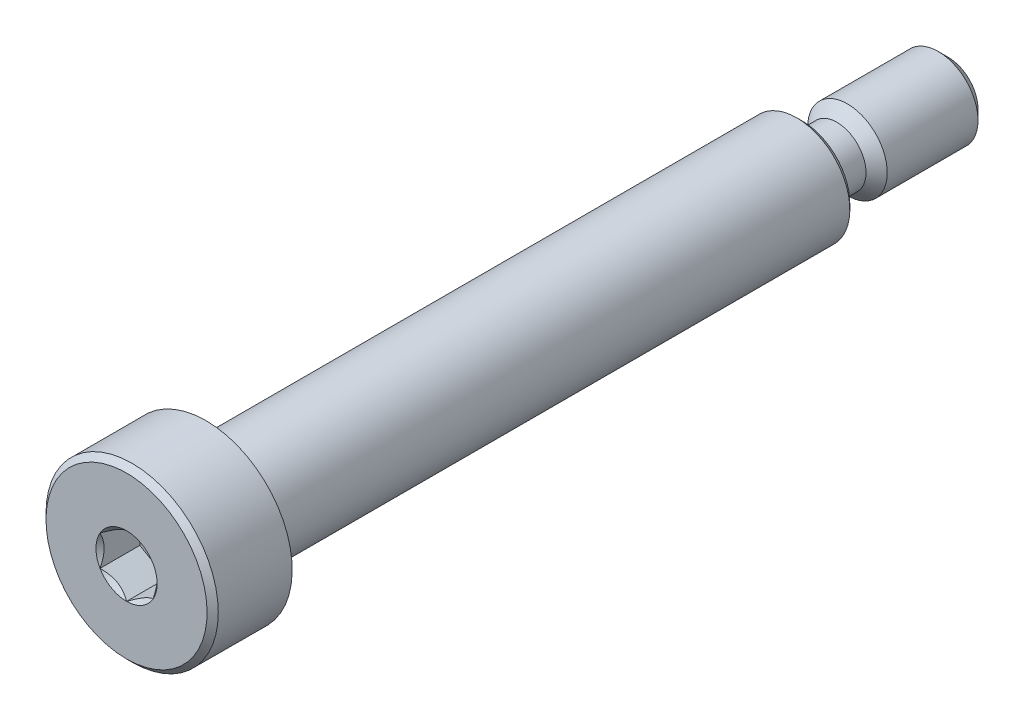
ISO-10303-21;
HEADER;
FILE_DESCRIPTION(('STEP AP214'),'2;1');
FILE_NAME('part.step','',(''),(''),'','','');
FILE_SCHEMA(('AUTOMOTIVE_DESIGN { 1 0 10303 214 1 1 1 1 }'));
ENDSEC;
DATA;
#1=APPLICATION_CONTEXT('core data for automotive mechanical design processes');
#2=APPLICATION_PROTOCOL_DEFINITION('international standard','automotive_design',2000,#1);
#3=PRODUCT_CONTEXT('',#1,'mechanical');
#4=PRODUCT('Part','Part','',(#3));
#5=PRODUCT_RELATED_PRODUCT_CATEGORY('part','',(#4));
#6=PRODUCT_DEFINITION_FORMATION('','',#4);
#7=PRODUCT_DEFINITION_CONTEXT('part definition',#1,'design');
#8=PRODUCT_DEFINITION('design','',#6,#7);
#9=PRODUCT_DEFINITION_SHAPE('','',#8);
#10=(LENGTH_UNIT() NAMED_UNIT(*) SI_UNIT(.MILLI.,.METRE.));
#11=(NAMED_UNIT(*) PLANE_ANGLE_UNIT() SI_UNIT($,.RADIAN.));
#12=(NAMED_UNIT(*) SI_UNIT($,.STERADIAN.) SOLID_ANGLE_UNIT());
#13=UNCERTAINTY_MEASURE_WITH_UNIT(LENGTH_MEASURE(1.E-05),#10,'distance_accuracy_value','');
#14=(GEOMETRIC_REPRESENTATION_CONTEXT(3) GLOBAL_UNCERTAINTY_ASSIGNED_CONTEXT((#13)) GLOBAL_UNIT_ASSIGNED_CONTEXT((#10,
#11,#12)) REPRESENTATION_CONTEXT('',''));
#15=CARTESIAN_POINT('',(0.,0.,0.));
#16=DIRECTION('',(0.,0.,1.));
#17=DIRECTION('',(1.,0.,0.));
#18=AXIS2_PLACEMENT_3D('',#15,#16,#17);
#19=CARTESIAN_POINT('',(0.,0.,-62.));
#20=DIRECTION('',(0.,0.,-1.));
#21=DIRECTION('',(0.,1.,0.));
#22=AXIS2_PLACEMENT_3D('',#19,#20,#21);
#23=CYLINDRICAL_SURFACE('',#22,4.);
#24=CARTESIAN_POINT('',(0.,0.,-50.5775));
#25=DIRECTION('',(0.,0.,-1.));
#26=DIRECTION('',(0.,1.,0.));
#27=AXIS2_PLACEMENT_3D('',#24,#25,#26);
#28=CIRCLE('',#27,4.);
#29=CARTESIAN_POINT('',(0.,4.,-50.5775));
#30=VERTEX_POINT('',#29);
#31=EDGE_CURVE('E244',#30,#30,#28,.F.);
#32=ORIENTED_EDGE('',*,*,#31,.T.);
#33=EDGE_LOOP('',(#32));
#34=FACE_BOUND('',#33,.T.);
#35=CARTESIAN_POINT('',(0.,0.,-7.12666666666666));
#36=DIRECTION('',(0.,0.,-1.));
#37=DIRECTION('',(0.,1.,0.));
#38=AXIS2_PLACEMENT_3D('',#35,#36,#37);
#39=CIRCLE('',#38,4.);
#40=CARTESIAN_POINT('',(0.,4.,-7.12666666666666));
#41=VERTEX_POINT('',#40);
#42=EDGE_CURVE('E266',#41,#41,#39,.T.);
#43=ORIENTED_EDGE('',*,*,#42,.T.);
#44=EDGE_LOOP('',(#43));
#45=FACE_BOUND('',#44,.T.);
#46=ADVANCED_FACE('F36',(#34,#45),#23,.T.);
#47=CARTESIAN_POINT('',(0.,-4.,-51.));
#48=DIRECTION('',(0.,0.,-1.));
#49=DIRECTION('',(0.,1.,0.));
#50=AXIS2_PLACEMENT_3D('',#47,#48,#49);
#51=PLANE('',#50);
#52=CARTESIAN_POINT('',(0.,0.,-51.));
#53=DIRECTION('',(0.,0.,-1.));
#54=DIRECTION('',(0.,1.,0.));
#55=AXIS2_PLACEMENT_3D('',#52,#53,#54);
#56=CIRCLE('',#55,3.5775);
#57=CARTESIAN_POINT('',(0.,3.5775,-51.));
#58=VERTEX_POINT('',#57);
#59=EDGE_CURVE('E247',#58,#58,#56,.T.);
#60=ORIENTED_EDGE('',*,*,#59,.T.);
#61=EDGE_LOOP('',(#60));
#62=FACE_BOUND('',#61,.T.);
#63=CARTESIAN_POINT('',(0.,0.,-51.));
#64=DIRECTION('',(0.,0.,-1.));
#65=DIRECTION('',(0.,1.,0.));
#66=AXIS2_PLACEMENT_3D('',#63,#64,#65);
#67=CIRCLE('',#66,3.00000000000001);
#68=CARTESIAN_POINT('',(0.,3.00000000000001,-51.));
#69=VERTEX_POINT('',#68);
#70=EDGE_CURVE('E286',#69,#69,#67,.T.);
#71=ORIENTED_EDGE('',*,*,#70,.F.);
#72=EDGE_LOOP('',(#71));
#73=FACE_BOUND('',#72,.T.);
#74=ADVANCED_FACE('F198',(#62,#73),#51,.T.);
#75=CARTESIAN_POINT('',(0.,0.,-62.));
#76=DIRECTION('',(0.,0.,-1.));
#77=DIRECTION('',(0.,1.,0.));
#78=AXIS2_PLACEMENT_3D('',#75,#76,#77);
#79=CYLINDRICAL_SURFACE('',#78,3.13333333333333);
#80=CARTESIAN_POINT('',(0.,0.,-6.60666666666668));
#81=DIRECTION('',(0.,0.,-1.));
#82=DIRECTION('',(0.,1.,0.));
#83=AXIS2_PLACEMENT_3D('',#80,#81,#82);
#84=CIRCLE('',#83,3.13333333333333);
#85=CARTESIAN_POINT('',(0.,3.13333333333333,-6.60666666666668));
#86=VERTEX_POINT('',#85);
#87=EDGE_CURVE('E282',#86,#86,#84,.F.);
#88=ORIENTED_EDGE('',*,*,#87,.T.);
#89=EDGE_LOOP('',(#88));
#90=FACE_BOUND('',#89,.T.);
#91=CARTESIAN_POINT('',(0.,0.,-6.));
#92=DIRECTION('',(0.,0.,-1.));
#93=DIRECTION('',(0.,1.,0.));
#94=AXIS2_PLACEMENT_3D('',#91,#92,#93);
#95=CIRCLE('',#94,3.13333333333333);
#96=CARTESIAN_POINT('',(0.,3.13333333333333,-6.));
#97=VERTEX_POINT('',#96);
#98=EDGE_CURVE('E267',#97,#97,#95,.T.);
#99=ORIENTED_EDGE('',*,*,#98,.T.);
#100=EDGE_LOOP('',(#99));
#101=FACE_BOUND('',#100,.T.);
#102=ADVANCED_FACE('F204',(#90,#101),#79,.T.);
#103=CARTESIAN_POINT('',(0.,4.,-6.86666666666667));
#104=DIRECTION('',(0.,0.,-1.));
#105=DIRECTION('',(0.,1.,0.));
#106=AXIS2_PLACEMENT_3D('',#103,#104,#105);
#107=PLANE('',#106);
#108=CARTESIAN_POINT('',(0.,0.,-6.86666666666667));
#109=DIRECTION('',(0.,0.,-1.));
#110=DIRECTION('',(0.,1.,0.));
#111=AXIS2_PLACEMENT_3D('',#108,#109,#110);
#112=CIRCLE('',#111,3.74000000000001);
#113=CARTESIAN_POINT('',(0.,3.74000000000001,-6.86666666666667));
#114=VERTEX_POINT('',#113);
#115=EDGE_CURVE('E279',#114,#114,#112,.F.);
#116=ORIENTED_EDGE('',*,*,#115,.T.);
#117=EDGE_LOOP('',(#116));
#118=FACE_BOUND('',#117,.T.);
#119=CARTESIAN_POINT('',(0.,0.,-6.86666666666667));
#120=DIRECTION('',(0.,0.,-1.));
#121=DIRECTION('',(0.,1.,0.));
#122=AXIS2_PLACEMENT_3D('',#119,#120,#121);
#123=CIRCLE('',#122,3.39333333333332);
#124=CARTESIAN_POINT('',(0.,3.39333333333332,-6.86666666666667));
#125=VERTEX_POINT('',#124);
#126=EDGE_CURVE('E270',#125,#125,#123,.T.);
#127=ORIENTED_EDGE('',*,*,#126,.T.);
#128=EDGE_LOOP('',(#127));
#129=FACE_BOUND('',#128,.T.);
#130=ADVANCED_FACE('F222',(#118,#129),#107,.F.);
#131=CARTESIAN_POINT('',(0.,0.,0.));
#132=DIRECTION('',(0.,0.,1.));
#133=DIRECTION('',(0.,-1.,0.));
#134=AXIS2_PLACEMENT_3D('',#131,#132,#133);
#135=PLANE('',#134);
#136=CARTESIAN_POINT('',(0.,0.,0.));
#137=DIRECTION('',(0.,0.,1.));
#138=DIRECTION('',(1.,0.,0.));
#139=AXIS2_PLACEMENT_3D('',#136,#137,#138);
#140=CIRCLE('',#139,2.3094010767585);
#141=CARTESIAN_POINT('',(0.,-2.3094010767585,0.));
#142=VERTEX_POINT('',#141);
#143=CARTESIAN_POINT('',(2.,-1.15470053837925,0.));
#144=VERTEX_POINT('',#143);
#145=EDGE_CURVE('E56',#142,#144,#140,.T.);
#146=ORIENTED_EDGE('',*,*,#145,.F.);
#147=CARTESIAN_POINT('',(-2.,-1.15470053837925,0.));
#148=VERTEX_POINT('',#147);
#149=EDGE_CURVE('E63',#148,#142,#140,.T.);
#150=ORIENTED_EDGE('',*,*,#149,.F.);
#151=CARTESIAN_POINT('',(-2.,1.15470053837925,0.));
#152=VERTEX_POINT('',#151);
#153=EDGE_CURVE('E137',#152,#148,#140,.T.);
#154=ORIENTED_EDGE('',*,*,#153,.F.);
#155=CARTESIAN_POINT('',(0.,2.3094010767585,0.));
#156=VERTEX_POINT('',#155);
#157=EDGE_CURVE('E132',#156,#152,#140,.T.);
#158=ORIENTED_EDGE('',*,*,#157,.F.);
#159=CARTESIAN_POINT('',(2.,1.15470053837925,0.));
#160=VERTEX_POINT('',#159);
#161=EDGE_CURVE('E104',#160,#156,#140,.T.);
#162=ORIENTED_EDGE('',*,*,#161,.F.);
#163=EDGE_CURVE('E95',#144,#160,#140,.T.);
#164=ORIENTED_EDGE('',*,*,#163,.F.);
#165=EDGE_LOOP('',(#146,#150,#154,#158,#162,#164));
#166=FACE_BOUND('',#165,.T.);
#167=CARTESIAN_POINT('',(0.,0.,0.));
#168=DIRECTION('',(0.,0.,1.));
#169=DIRECTION('',(0.,-1.,0.));
#170=AXIS2_PLACEMENT_3D('',#167,#168,#169);
#171=CIRCLE('',#170,6.07749999999999);
#172=CARTESIAN_POINT('',(0.,-6.07749999999999,0.));
#173=VERTEX_POINT('',#172);
#174=EDGE_CURVE('E50',#173,#173,#171,.T.);
#175=ORIENTED_EDGE('',*,*,#174,.T.);
#176=EDGE_LOOP('',(#175));
#177=FACE_BOUND('',#176,.T.);
#178=ADVANCED_FACE('F129',(#166,#177),#135,.T.);
#179=CARTESIAN_POINT('',(0.,0.,-62.));
#180=DIRECTION('',(0.,0.,-1.));
#181=DIRECTION('',(0.,1.,0.));
#182=AXIS2_PLACEMENT_3D('',#179,#180,#181);
#183=CYLINDRICAL_SURFACE('',#182,6.49999999999999);
#184=CARTESIAN_POINT('',(0.,0.,-0.422500000000006));
#185=DIRECTION('',(0.,0.,1.));
#186=DIRECTION('',(0.,-1.,0.));
#187=AXIS2_PLACEMENT_3D('',#184,#185,#186);
#188=CIRCLE('',#187,6.49999999999999);
#189=CARTESIAN_POINT('',(0.,-6.49999999999999,-0.422500000000006));
#190=VERTEX_POINT('',#189);
#191=EDGE_CURVE('E250',#190,#190,#188,.F.);
#192=ORIENTED_EDGE('',*,*,#191,.T.);
#193=EDGE_LOOP('',(#192));
#194=FACE_BOUND('',#193,.T.);
#195=CARTESIAN_POINT('',(0.,0.,-6.));
#196=DIRECTION('',(0.,0.,-1.));
#197=DIRECTION('',(0.,1.,0.));
#198=AXIS2_PLACEMENT_3D('',#195,#196,#197);
#199=CIRCLE('',#198,6.49999999999999);
#200=CARTESIAN_POINT('',(0.,6.49999999999999,-6.));
#201=VERTEX_POINT('',#200);
#202=EDGE_CURVE('E265',#201,#201,#199,.T.);
#203=ORIENTED_EDGE('',*,*,#202,.F.);
#204=EDGE_LOOP('',(#203));
#205=FACE_BOUND('',#204,.T.);
#206=ADVANCED_FACE('F215',(#194,#205),#183,.T.);
#207=CARTESIAN_POINT('',(0.,-6.49999999999999,-6.));
#208=DIRECTION('',(0.,0.,-1.));
#209=DIRECTION('',(0.,1.,0.));
#210=AXIS2_PLACEMENT_3D('',#207,#208,#209);
#211=PLANE('',#210);
#212=ORIENTED_EDGE('',*,*,#202,.T.);
#213=EDGE_LOOP('',(#212));
#214=FACE_BOUND('',#213,.T.);
#215=ORIENTED_EDGE('',*,*,#98,.F.);
#216=EDGE_LOOP('',(#215));
#217=FACE_BOUND('',#216,.T.);
#218=ADVANCED_FACE('F211',(#214,#217),#211,.T.);
#219=CARTESIAN_POINT('',(0.,0.,-7.12666666666666));
#220=DIRECTION('',(0.,0.,-1.));
#221=DIRECTION('',(0.,1.,0.));
#222=AXIS2_PLACEMENT_3D('',#219,#220,#221);
#223=CONICAL_SURFACE('',#222,4.,0.785398163397452);
#224=ORIENTED_EDGE('',*,*,#115,.F.);
#225=EDGE_LOOP('',(#224));
#226=FACE_BOUND('',#225,.T.);
#227=ORIENTED_EDGE('',*,*,#42,.F.);
#228=EDGE_LOOP('',(#227));
#229=FACE_BOUND('',#228,.T.);
#230=ADVANCED_FACE('F214',(#226,#229),#223,.T.);
#231=CARTESIAN_POINT('',(0.,0.,-6.86666666666667));
#232=DIRECTION('',(0.,0.,-1.));
#233=DIRECTION('',(0.,1.,0.));
#234=AXIS2_PLACEMENT_3D('',#231,#232,#233);
#235=CONICAL_SURFACE('',#234,3.39333333333332,0.785398163397454);
#236=ORIENTED_EDGE('',*,*,#87,.F.);
#237=EDGE_LOOP('',(#236));
#238=FACE_BOUND('',#237,.T.);
#239=ORIENTED_EDGE('',*,*,#126,.F.);
#240=EDGE_LOOP('',(#239));
#241=FACE_BOUND('',#240,.T.);
#242=ADVANCED_FACE('F225',(#238,#241),#235,.T.);
#243=CARTESIAN_POINT('',(0.,0.,-51.8));
#244=DIRECTION('',(0.,0.,-1.));
#245=DIRECTION('',(0.,1.,0.));
#246=AXIS2_PLACEMENT_3D('',#243,#244,#245);
#247=TOROIDAL_SURFACE('',#246,3.00000000000001,0.800000000000014);
#248=CARTESIAN_POINT('',(0.,0.,-51.8));
#249=DIRECTION('',(0.,0.,-1.));
#250=DIRECTION('',(0.,1.,0.));
#251=AXIS2_PLACEMENT_3D('',#248,#249,#250);
#252=CIRCLE('',#251,2.2);
#253=CARTESIAN_POINT('',(0.,2.2,-51.8));
#254=VERTEX_POINT('',#253);
#255=EDGE_CURVE('E351',#254,#254,#252,.T.);
#256=ORIENTED_EDGE('',*,*,#255,.F.);
#257=EDGE_LOOP('',(#256));
#258=FACE_BOUND('',#257,.T.);
#259=ORIENTED_EDGE('',*,*,#70,.T.);
#260=EDGE_LOOP('',(#259));
#261=FACE_BOUND('',#260,.T.);
#262=ADVANCED_FACE('F229',(#258,#261),#247,.F.);
#263=CARTESIAN_POINT('',(0.,0.,-62.));
#264=DIRECTION('',(0.,0.,-1.));
#265=DIRECTION('',(0.,1.,0.));
#266=AXIS2_PLACEMENT_3D('',#263,#264,#265);
#267=CYLINDRICAL_SURFACE('',#266,2.2);
#268=CARTESIAN_POINT('',(0.,0.,-53.6));
#269=DIRECTION('',(0.,0.,-1.));
#270=DIRECTION('',(0.,1.,0.));
#271=AXIS2_PLACEMENT_3D('',#268,#269,#270);
#272=CIRCLE('',#271,2.2);
#273=CARTESIAN_POINT('',(0.,2.2,-53.6));
#274=VERTEX_POINT('',#273);
#275=EDGE_CURVE('E340',#274,#274,#272,.T.);
#276=ORIENTED_EDGE('',*,*,#275,.F.);
#277=EDGE_LOOP('',(#276));
#278=FACE_BOUND('',#277,.T.);
#279=ORIENTED_EDGE('',*,*,#255,.T.);
#280=EDGE_LOOP('',(#279));
#281=FACE_BOUND('',#280,.T.);
#282=ADVANCED_FACE('F300',(#278,#281),#267,.T.);
#283=CARTESIAN_POINT('',(0.,0.,-53.6));
#284=DIRECTION('',(0.,0.,-1.));
#285=DIRECTION('',(0.,1.,0.));
#286=AXIS2_PLACEMENT_3D('',#283,#284,#285);
#287=CONICAL_SURFACE('',#286,2.2,0.785398163397442);
#288=CARTESIAN_POINT('',(0.,0.,-54.4));
#289=DIRECTION('',(0.,0.,-1.));
#290=DIRECTION('',(0.,1.,0.));
#291=AXIS2_PLACEMENT_3D('',#288,#289,#290);
#292=CIRCLE('',#291,3.00000000000001);
#293=CARTESIAN_POINT('',(0.,3.00000000000001,-54.4));
#294=VERTEX_POINT('',#293);
#295=EDGE_CURVE('E273',#294,#294,#292,.F.);
#296=ORIENTED_EDGE('',*,*,#295,.T.);
#297=EDGE_LOOP('',(#296));
#298=FACE_BOUND('',#297,.T.);
#299=ORIENTED_EDGE('',*,*,#275,.T.);
#300=EDGE_LOOP('',(#299));
#301=FACE_BOUND('',#300,.T.);
#302=ADVANCED_FACE('F293',(#298,#301),#287,.T.);
#303=CARTESIAN_POINT('',(0.,-3.00000000000001,-62.));
#304=DIRECTION('',(0.,0.,-1.));
#305=DIRECTION('',(0.,1.,0.));
#306=AXIS2_PLACEMENT_3D('',#303,#304,#305);
#307=PLANE('',#306);
#308=CARTESIAN_POINT('',(0.,0.,-62.));
#309=DIRECTION('',(0.,0.,-1.));
#310=DIRECTION('',(0.,1.,0.));
#311=AXIS2_PLACEMENT_3D('',#308,#309,#310);
#312=CIRCLE('',#311,2.25000000000003);
#313=CARTESIAN_POINT('',(0.,-2.25000000000004,-62.));
#314=VERTEX_POINT('',#313);
#315=EDGE_CURVE('E253',#314,#314,#312,.T.);
#316=ORIENTED_EDGE('',*,*,#315,.T.);
#317=EDGE_LOOP('',(#316));
#318=FACE_BOUND('',#317,.T.);
#319=ADVANCED_FACE('F290',(#318),#307,.T.);
#320=CARTESIAN_POINT('',(0.,0.,-62.));
#321=DIRECTION('',(0.,0.,-1.));
#322=DIRECTION('',(0.,1.,0.));
#323=AXIS2_PLACEMENT_3D('',#320,#321,#322);
#324=CYLINDRICAL_SURFACE('',#323,3.00000000000001);
#325=CARTESIAN_POINT('',(0.,0.,-61.25));
#326=DIRECTION('',(0.,0.,-1.));
#327=DIRECTION('',(0.,1.,0.));
#328=AXIS2_PLACEMENT_3D('',#325,#326,#327);
#329=CIRCLE('',#328,3.00000000000001);
#330=CARTESIAN_POINT('',(0.,-3.00000000000002,-61.25));
#331=VERTEX_POINT('',#330);
#332=EDGE_CURVE('E248',#331,#331,#329,.F.);
#333=ORIENTED_EDGE('',*,*,#332,.T.);
#334=EDGE_LOOP('',(#333));
#335=FACE_BOUND('',#334,.T.);
#336=ORIENTED_EDGE('',*,*,#295,.F.);
#337=EDGE_LOOP('',(#336));
#338=FACE_BOUND('',#337,.T.);
#339=ADVANCED_FACE('F234',(#335,#338),#324,.T.);
#340=CARTESIAN_POINT('',(0.,0.,-62.));
#341=DIRECTION('',(0.,0.,1.));
#342=DIRECTION('',(0.,-1.,0.));
#343=AXIS2_PLACEMENT_3D('',#340,#341,#342);
#344=CONICAL_SURFACE('',#343,2.25000000000003,0.785398163397441);
#345=CARTESIAN_POINT('',(0.,-3.00000000000002,-61.25));
#346=CARTESIAN_POINT('',(0.,-2.99218750000002,-61.2578125));
#347=CARTESIAN_POINT('',(0.,-2.98437500000002,-61.265625));
#348=CARTESIAN_POINT('',(0.,-2.96875000000002,-61.28125));
#349=CARTESIAN_POINT('',(0.,-2.96093750000002,-61.2890625));
#350=CARTESIAN_POINT('',(0.,-2.94531250000002,-61.3046875));
#351=CARTESIAN_POINT('',(0.,-2.93750000000002,-61.3125));
#352=CARTESIAN_POINT('',(0.,-2.92187500000002,-61.328125));
#353=CARTESIAN_POINT('',(0.,-2.91406250000002,-61.3359375));
#354=CARTESIAN_POINT('',(0.,-2.89843750000002,-61.3515625));
#355=CARTESIAN_POINT('',(0.,-2.89062500000002,-61.359375));
#356=CARTESIAN_POINT('',(0.,-2.87500000000002,-61.375));
#357=CARTESIAN_POINT('',(0.,-2.86718750000002,-61.3828125));
#358=CARTESIAN_POINT('',(0.,-2.85156250000002,-61.3984375));
#359=CARTESIAN_POINT('',(0.,-2.84375000000002,-61.40625));
#360=CARTESIAN_POINT('',(0.,-2.82812500000002,-61.421875));
#361=CARTESIAN_POINT('',(0.,-2.82031250000002,-61.4296875));
#362=CARTESIAN_POINT('',(0.,-2.80468750000002,-61.4453125));
#363=CARTESIAN_POINT('',(0.,-2.79687500000002,-61.453125));
#364=CARTESIAN_POINT('',(0.,-2.78125000000002,-61.46875));
#365=CARTESIAN_POINT('',(0.,-2.77343750000002,-61.4765625));
#366=CARTESIAN_POINT('',(0.,-2.75781250000002,-61.4921875));
#367=CARTESIAN_POINT('',(0.,-2.75000000000002,-61.5));
#368=CARTESIAN_POINT('',(0.,-2.73437500000002,-61.515625));
#369=CARTESIAN_POINT('',(0.,-2.72656250000003,-61.5234375));
#370=CARTESIAN_POINT('',(0.,-2.71093750000003,-61.5390625));
#371=CARTESIAN_POINT('',(0.,-2.70312500000002,-61.546875));
#372=CARTESIAN_POINT('',(0.,-2.68750000000002,-61.5625));
#373=CARTESIAN_POINT('',(0.,-2.67968750000003,-61.5703125));
#374=CARTESIAN_POINT('',(0.,-2.66406250000003,-61.5859375));
#375=CARTESIAN_POINT('',(0.,-2.65625000000003,-61.59375));
#376=CARTESIAN_POINT('',(0.,-2.64062500000003,-61.609375));
#377=CARTESIAN_POINT('',(0.,-2.63281250000003,-61.6171875));
#378=CARTESIAN_POINT('',(0.,-2.61718750000003,-61.6328125));
#379=CARTESIAN_POINT('',(0.,-2.60937500000003,-61.640625));
#380=CARTESIAN_POINT('',(0.,-2.59375000000003,-61.65625));
#381=CARTESIAN_POINT('',(0.,-2.58593750000003,-61.6640625));
#382=CARTESIAN_POINT('',(0.,-2.57031250000003,-61.6796875));
#383=CARTESIAN_POINT('',(0.,-2.56250000000003,-61.6875));
#384=CARTESIAN_POINT('',(0.,-2.54687500000003,-61.703125));
#385=CARTESIAN_POINT('',(0.,-2.53906250000003,-61.7109375));
#386=CARTESIAN_POINT('',(0.,-2.52343750000003,-61.7265625));
#387=CARTESIAN_POINT('',(0.,-2.51562500000003,-61.734375));
#388=CARTESIAN_POINT('',(0.,-2.50000000000003,-61.75));
#389=CARTESIAN_POINT('',(0.,-2.49218750000003,-61.7578125));
#390=CARTESIAN_POINT('',(0.,-2.47656250000003,-61.7734375));
#391=CARTESIAN_POINT('',(0.,-2.46875000000003,-61.78125));
#392=CARTESIAN_POINT('',(0.,-2.45312500000003,-61.796875));
#393=CARTESIAN_POINT('',(0.,-2.44531250000003,-61.8046875));
#394=CARTESIAN_POINT('',(0.,-2.42968750000003,-61.8203125));
#395=CARTESIAN_POINT('',(0.,-2.42187500000003,-61.828125));
#396=CARTESIAN_POINT('',(0.,-2.40625000000003,-61.84375));
#397=CARTESIAN_POINT('',(0.,-2.39843750000003,-61.8515625));
#398=CARTESIAN_POINT('',(0.,-2.38281250000003,-61.8671875));
#399=CARTESIAN_POINT('',(0.,-2.37500000000003,-61.875));
#400=CARTESIAN_POINT('',(0.,-2.35937500000003,-61.890625));
#401=CARTESIAN_POINT('',(0.,-2.35156250000003,-61.8984375));
#402=CARTESIAN_POINT('',(0.,-2.33593750000003,-61.9140625));
#403=CARTESIAN_POINT('',(0.,-2.32812500000003,-61.921875));
#404=CARTESIAN_POINT('',(0.,-2.31250000000003,-61.9375));
#405=CARTESIAN_POINT('',(0.,-2.30468750000003,-61.9453125));
#406=CARTESIAN_POINT('',(0.,-2.28906250000004,-61.9609375));
#407=CARTESIAN_POINT('',(0.,-2.28125000000004,-61.96875));
#408=CARTESIAN_POINT('',(0.,-2.26562500000004,-61.984375));
#409=CARTESIAN_POINT('',(0.,-2.25781250000004,-61.9921875));
#410=CARTESIAN_POINT('',(0.,-2.25000000000004,-62.));
#411=B_SPLINE_CURVE_WITH_KNOTS('',3,(#345,#346,#347,#348,#349,#350,#351,#352,#353,#354,#355,
#356,#357,#358,#359,#360,#361,#362,#363,#364,#365,#366,#367,#368,#369,#370,#371,#372,#373,#374,
#375,#376,#377,#378,#379,#380,#381,#382,#383,#384,#385,#386,#387,#388,#389,#390,#391,#392,#393,
#394,#395,#396,#397,#398,#399,#400,#401,#402,#403,#404,#405,#406,#407,#408,#409,#410),
.UNSPECIFIED.,.F.,.F.,(4,2,2,2,2,2,2,2,2,2,2,2,2,2,2,2,2,2,2,2,2,2,2,2,2,2,2,2,2,2,2,2,4),(0.,
0.0331456303681148,0.0662912607362346,0.099436891104354,0.132582521472474,0.165728151840594,
0.198873782208713,0.232019412576828,0.265165042944948,0.298310673313067,0.331456303681187,
0.364601934049307,0.397747564417426,0.430893194785541,0.464038825153661,0.49718445552178,
0.5303300858899,0.56347571625802,0.596621346626139,0.629766976994259,0.662912607362373,
0.696058237730493,0.729203868098613,0.762349498466732,0.795495128834852,0.828640759202972,
0.861786389571086,0.894932019939206,0.928077650307325,0.961223280675445,0.994368911043565,
1.02751454141168,1.0606601717798),.UNSPECIFIED.);
#412=EDGE_CURVE('BSEAM231',#331,#314,#411,.T.);
#413=ORIENTED_EDGE('',*,*,#332,.F.);
#414=ORIENTED_EDGE('',*,*,#315,.F.);
#415=ORIENTED_EDGE('',*,*,#412,.T.);
#416=ORIENTED_EDGE('',*,*,#412,.F.);
#417=EDGE_LOOP('',(#413,#415,#414,#416));
#418=FACE_BOUND('',#417,.T.);
#419=ADVANCED_FACE('F231',(#418),#344,.T.);
#420=CARTESIAN_POINT('',(0.,0.,-51.));
#421=DIRECTION('',(0.,0.,1.));
#422=DIRECTION('',(0.,-1.,0.));
#423=AXIS2_PLACEMENT_3D('',#420,#421,#422);
#424=CONICAL_SURFACE('',#423,3.5775,0.78539816339745);
#425=ORIENTED_EDGE('',*,*,#31,.F.);
#426=EDGE_LOOP('',(#425));
#427=FACE_BOUND('',#426,.T.);
#428=ORIENTED_EDGE('',*,*,#59,.F.);
#429=EDGE_LOOP('',(#428));
#430=FACE_BOUND('',#429,.T.);
#431=ADVANCED_FACE('F233',(#427,#430),#424,.T.);
#432=CARTESIAN_POINT('',(0.,0.,-0.422500000000006));
#433=DIRECTION('',(0.,0.,-1.));
#434=DIRECTION('',(0.,1.,0.));
#435=AXIS2_PLACEMENT_3D('',#432,#433,#434);
#436=CONICAL_SURFACE('',#435,6.49999999999999,0.785398163397442);
#437=ORIENTED_EDGE('',*,*,#174,.F.);
#438=EDGE_LOOP('',(#437));
#439=FACE_BOUND('',#438,.T.);
#440=ORIENTED_EDGE('',*,*,#191,.F.);
#441=EDGE_LOOP('',(#440));
#442=FACE_BOUND('',#441,.T.);
#443=ADVANCED_FACE('F38',(#439,#442),#436,.T.);
#444=CARTESIAN_POINT('',(0.,0.,0.));
#445=DIRECTION('',(0.,0.,1.));
#446=DIRECTION('',(1.,0.,0.));
#447=AXIS2_PLACEMENT_3D('',#444,#445,#446);
#448=CONICAL_SURFACE('',#447,2.3094010767585,0.78539816339745);
#449=ORIENTED_EDGE('',*,*,#161,.T.);
#450=CARTESIAN_POINT('',(2.0002,1.15458506832541,0.000115478713659639));
#451=CARTESIAN_POINT('',(1.93144696596929,1.19427965103065,-0.0395469097744077));
#452=CARTESIAN_POINT('',(1.86154425786449,1.23463799837204,-0.076880017715838));
#453=CARTESIAN_POINT('',(1.71900475544956,1.31693321846145,-0.145236314863857));
#454=CARTESIAN_POINT('',(1.64635440243464,1.35887791933134,-0.176221466262779));
#455=CARTESIAN_POINT('',(1.49985839894603,1.44345742638069,-0.229299783455857));
#456=CARTESIAN_POINT('',(1.42605006475371,1.48607068799507,-0.251526372823389));
#457=CARTESIAN_POINT('',(1.27680836816474,1.57223542169503,-0.285771183324919));
#458=CARTESIAN_POINT('',(1.20137956608185,1.61578426088223,-0.297814970855865));
#459=CARTESIAN_POINT('',(1.07138449932892,1.69083694766536,-0.308681488094428));
#460=CARTESIAN_POINT('',(1.01698621602989,1.72224381117151,-0.31029024639003));
#461=CARTESIAN_POINT('',(0.908278544480307,1.78500621460364,-0.307581122401289));
#462=CARTESIAN_POINT('',(0.853969194078661,1.81636173267754,-0.303261162242026));
#463=CARTESIAN_POINT('',(0.745863272410662,1.87877671565355,-0.288940432590094));
#464=CARTESIAN_POINT('',(0.692067343445208,1.90983580972306,-0.278933307237994));
#465=CARTESIAN_POINT('',(0.585405737694427,1.97141691651548,-0.253787569750341));
#466=CARTESIAN_POINT('',(0.532539989929288,2.00193897021859,-0.23864935095776));
#467=CARTESIAN_POINT('',(0.397120266910156,2.08012358375727,-0.19370549657081));
#468=CARTESIAN_POINT('',(0.315406165150522,2.12730124240478,-0.160511160574184));
#469=CARTESIAN_POINT('',(0.195252962742198,2.19667172615922,-0.10447417682863));
#470=CARTESIAN_POINT('',(0.155657147890823,2.21953238052245,-0.0847852970530601));
#471=CARTESIAN_POINT('',(0.0771990411121281,2.26483018959124,-0.0436126816351289));
#472=CARTESIAN_POINT('',(0.0383363164062602,2.28726759416161,-0.0221300483487535));
#473=CARTESIAN_POINT('',(-0.000199999999999342,2.30951654681234,0.000115478713659038));
#474=B_SPLINE_CURVE_WITH_KNOTS('',3,(#450,#451,#452,#453,#454,#455,#456,#457,#458,#459,#460,
#461,#462,#463,#464,#465,#466,#467,#468,#469,#470,#471,#472,#473),.UNSPECIFIED.,.F.,.F.,(4,2,2,
2,2,2,2,2,2,2,2,4),(0.,0.266420613771064,0.534393751523388,0.798110374376914,1.06116288956936,
1.24939906803722,1.43770123566247,1.62621426093932,1.81471283831913,2.11415604834145,
2.2634717071779,2.41269626969771),.UNSPECIFIED.);
#475=EDGE_CURVE('E11',#160,#156,#474,.T.);
#476=ORIENTED_EDGE('',*,*,#475,.F.);
#477=EDGE_LOOP('',(#449,#476));
#478=FACE_BOUND('',#477,.T.);
#479=ADVANCED_FACE('F107',(#478),#448,.F.);
#480=ORIENTED_EDGE('',*,*,#157,.T.);
#481=CARTESIAN_POINT('',(0.000200000000000682,2.30951654681234,0.000115478713659074));
#482=CARTESIAN_POINT('',(-0.0685530340307048,2.26982196410711,-0.0395469097744083));
#483=CARTESIAN_POINT('',(-0.138455742135511,2.22946361676572,-0.0768800177158386));
#484=CARTESIAN_POINT('',(-0.280995244550436,2.1471683966763,-0.145236314863857));
#485=CARTESIAN_POINT('',(-0.353645597565358,2.10522369580642,-0.17622146626278));
#486=CARTESIAN_POINT('',(-0.500141601053971,2.02064418875706,-0.229299783455858));
#487=CARTESIAN_POINT('',(-0.573949935246294,1.97803092714269,-0.25152637282339));
#488=CARTESIAN_POINT('',(-0.723191631835264,1.89186619344273,-0.28577118332492));
#489=CARTESIAN_POINT('',(-0.798620433918152,1.84831735425552,-0.297814970855866));
#490=CARTESIAN_POINT('',(-0.928615500671079,1.7732646674724,-0.308681488094429));
#491=CARTESIAN_POINT('',(-0.983013783970109,1.74185780396625,-0.31029024639003));
#492=CARTESIAN_POINT('',(-1.09172145551969,1.67909540053412,-0.307581122401289));
#493=CARTESIAN_POINT('',(-1.14603080592134,1.64773988246021,-0.303261162242026));
#494=CARTESIAN_POINT('',(-1.25413672758934,1.5853248994842,-0.288940432590095));
#495=CARTESIAN_POINT('',(-1.30793265655479,1.55426580541469,-0.278933307237994));
#496=CARTESIAN_POINT('',(-1.41459426230557,1.49268469862228,-0.253787569750341));
#497=CARTESIAN_POINT('',(-1.46746001007071,1.46216264491917,-0.238649350957761));
#498=CARTESIAN_POINT('',(-1.60287973308984,1.38397803138049,-0.19370549657081));
#499=CARTESIAN_POINT('',(-1.68459383484948,1.33680037273297,-0.160511160574184));
#500=CARTESIAN_POINT('',(-1.8047470372578,1.26742988897853,-0.104474176828631));
#501=CARTESIAN_POINT('',(-1.84434285210918,1.24456923461531,-0.0847852970530608));
#502=CARTESIAN_POINT('',(-1.92280095888787,1.19927142554652,-0.0436126816351295));
#503=CARTESIAN_POINT('',(-1.96166368359374,1.17683402097614,-0.0221300483487539));
#504=CARTESIAN_POINT('',(-2.0002,1.15458506832541,0.000115478713658824));
#505=B_SPLINE_CURVE_WITH_KNOTS('',3,(#481,#482,#483,#484,#485,#486,#487,#488,#489,#490,#491,
#492,#493,#494,#495,#496,#497,#498,#499,#500,#501,#502,#503,#504),.UNSPECIFIED.,.F.,.F.,(4,2,2,
2,2,2,2,2,2,2,2,4),(0.,0.266420613771063,0.534393751523388,0.798110374376915,1.06116288956936,
1.24939906803722,1.43770123566248,1.62621426093932,1.81471283831913,2.11415604834145,
2.2634717071779,2.41269626969771),.UNSPECIFIED.);
#506=EDGE_CURVE('E133',#156,#152,#505,.T.);
#507=ORIENTED_EDGE('',*,*,#506,.F.);
#508=EDGE_LOOP('',(#480,#507));
#509=FACE_BOUND('',#508,.T.);
#510=ADVANCED_FACE('F372',(#509),#448,.F.);
#511=ORIENTED_EDGE('',*,*,#153,.T.);
#512=CARTESIAN_POINT('',(-2.,-2.30294417292923,0.740771355027721));
#513=CARTESIAN_POINT('',(-2.,-2.24687002663712,0.698443273625964));
#514=CARTESIAN_POINT('',(-2.,-2.19048190536959,0.656525156864338));
#515=CARTESIAN_POINT('',(-2.,-2.07695390496424,0.573690417861017));
#516=CARTESIAN_POINT('',(-2.,-2.01981384066454,0.532774049668074));
#517=CARTESIAN_POINT('',(-2.,-1.90424016804776,0.451833452018563));
#518=CARTESIAN_POINT('',(-2.,-1.8457999674391,0.411818591559868));
#519=CARTESIAN_POINT('',(-2.,-1.7279274546176,0.333288993664294));
#520=CARTESIAN_POINT('',(-2.,-1.66849521292324,0.294774150243142));
#521=CARTESIAN_POINT('',(-2.,-1.4816299571002,0.177640651604295));
#522=CARTESIAN_POINT('',(-2.,-1.35220318163536,0.102145901729644));
#523=CARTESIAN_POINT('',(-2.,-1.08689521592924,-0.035950649005619));
#524=CARTESIAN_POINT('',(-2.,-0.951037763938191,-0.0985959140965044));
#525=CARTESIAN_POINT('',(-2.,-0.747111912259408,-0.175236456124857));
#526=CARTESIAN_POINT('',(-2.,-0.682064034147875,-0.197232820080877));
#527=CARTESIAN_POINT('',(-2.,-0.550398103294751,-0.23600331233986));
#528=CARTESIAN_POINT('',(-2.,-0.483779942722474,-0.252777080878817));
#529=CARTESIAN_POINT('',(-2.,-0.350484328847653,-0.279951742115555));
#530=CARTESIAN_POINT('',(-2.,-0.283829489364785,-0.290461823258314));
#531=CARTESIAN_POINT('',(-2.,-0.149806987139376,-0.304903914455084));
#532=CARTESIAN_POINT('',(-2.,-0.0824394489341211,-0.308837055266886));
#533=CARTESIAN_POINT('',(-2.,0.0499055622944906,-0.309833523066283));
#534=CARTESIAN_POINT('',(-2.,0.114881285143173,-0.307140355149591));
#535=CARTESIAN_POINT('',(-2.,0.244275921482762,-0.295569929577308));
#536=CARTESIAN_POINT('',(-2.,0.308694780266754,-0.286692071166776));
#537=CARTESIAN_POINT('',(-2.,0.437599788610706,-0.263086340703852));
#538=CARTESIAN_POINT('',(-2.,0.502067428644596,-0.248258916553488));
#539=CARTESIAN_POINT('',(-2.,0.629594322598307,-0.21354211637203));
#540=CARTESIAN_POINT('',(-2.,0.692653693883151,-0.193653163893724));
#541=CARTESIAN_POINT('',(-2.,0.891187889210545,-0.123553020743801));
#542=CARTESIAN_POINT('',(-2.,1.02383545707306,-0.065358199678491));
#543=CARTESIAN_POINT('',(-2.,1.28290932150074,0.0640305754595763));
#544=CARTESIAN_POINT('',(-2.,1.4093111258757,0.135271231414841));
#545=CARTESIAN_POINT('',(-2.,1.59200441438963,0.24644199187472));
#546=CARTESIAN_POINT('',(-2.,1.65027549026191,0.283182190337375));
#547=CARTESIAN_POINT('',(-2.,1.76581760389243,0.358214514183766));
#548=CARTESIAN_POINT('',(-2.,1.82308856543105,0.396506757118039));
#549=CARTESIAN_POINT('',(-2.,1.93629654762084,0.474042264081225));
#550=CARTESIAN_POINT('',(-2.,1.99224062500539,0.513275276133585));
#551=CARTESIAN_POINT('',(-2.,2.103364240299,0.592778830736516));
#552=CARTESIAN_POINT('',(-2.,2.15854398422468,0.633049085000597));
#553=CARTESIAN_POINT('',(-2.,2.21340370692659,0.673744238145942));
#554=B_SPLINE_CURVE_WITH_KNOTS('',3,(#512,#513,#514,#515,#516,#517,#518,#519,#520,#521,#522,
#523,#524,#525,#526,#527,#528,#529,#530,#531,#532,#533,#534,#535,#536,#537,#538,#539,#540,#541,
#542,#543,#544,#545,#546,#547,#548,#549,#550,#551,#552,#553),.UNSPECIFIED.,.F.,.F.,(4,2,2,2,2,2,
2,2,2,2,2,2,2,2,2,2,2,2,2,2,4),(0.,0.210772731976891,0.421598374658589,0.634057554623488,
0.84650169587017,1.29562155455624,1.74319622821645,1.94902062110207,2.15485918928326,
2.35699582502635,2.5590977043214,2.75388435553556,2.94868993014815,3.14690093452586,
3.34509535789702,3.77838155837654,4.21325029921625,4.41989056685647,4.62654651460921,
4.8315237711129,5.03644465914085),.UNSPECIFIED.);
#555=EDGE_CURVE('E135',#152,#148,#554,.F.);
#556=ORIENTED_EDGE('',*,*,#555,.F.);
#557=EDGE_LOOP('',(#511,#556));
#558=FACE_BOUND('',#557,.T.);
#559=ADVANCED_FACE('F369',(#558),#448,.F.);
#560=ORIENTED_EDGE('',*,*,#149,.T.);
#561=CARTESIAN_POINT('',(-2.0002,-1.15458506832541,0.000115478713658772));
#562=CARTESIAN_POINT('',(-1.93144696596929,-1.19427965103064,-0.0395469097744086));
#563=CARTESIAN_POINT('',(-1.86154425786449,-1.23463799837204,-0.0768800177158389));
#564=CARTESIAN_POINT('',(-1.71900475544956,-1.31693321846145,-0.145236314863858));
#565=CARTESIAN_POINT('',(-1.64635440243464,-1.35887791933134,-0.17622146626278));
#566=CARTESIAN_POINT('',(-1.49985839894603,-1.44345742638069,-0.229299783455858));
#567=CARTESIAN_POINT('',(-1.42605006475371,-1.48607068799507,-0.25152637282339));
#568=CARTESIAN_POINT('',(-1.27680836816474,-1.57223542169503,-0.28577118332492));
#569=CARTESIAN_POINT('',(-1.20137956608185,-1.61578426088223,-0.297814970855866));
#570=CARTESIAN_POINT('',(-1.07138449932892,-1.69083694766536,-0.308681488094429));
#571=CARTESIAN_POINT('',(-1.01698621602989,-1.72224381117151,-0.31029024639003));
#572=CARTESIAN_POINT('',(-0.908278544480308,-1.78500621460364,-0.307581122401289));
#573=CARTESIAN_POINT('',(-0.853969194078662,-1.81636173267754,-0.303261162242027));
#574=CARTESIAN_POINT('',(-0.745863272410663,-1.87877671565355,-0.288940432590095));
#575=CARTESIAN_POINT('',(-0.692067343445209,-1.90983580972306,-0.278933307237994));
#576=CARTESIAN_POINT('',(-0.585405737694428,-1.97141691651547,-0.253787569750341));
#577=CARTESIAN_POINT('',(-0.532539989929289,-2.00193897021859,-0.238649350957761));
#578=CARTESIAN_POINT('',(-0.397120266910157,-2.08012358375727,-0.193705496570811));
#579=CARTESIAN_POINT('',(-0.315406165150522,-2.12730124240478,-0.160511160574185));
#580=CARTESIAN_POINT('',(-0.195252962742198,-2.19667172615922,-0.104474176828631));
#581=CARTESIAN_POINT('',(-0.155657147890823,-2.21953238052245,-0.0847852970530607));
#582=CARTESIAN_POINT('',(-0.0771990411121283,-2.26483018959124,-0.0436126816351293));
#583=CARTESIAN_POINT('',(-0.0383363164062603,-2.28726759416161,-0.0221300483487537));
#584=CARTESIAN_POINT('',(0.000199999999999315,-2.30951654681234,0.000115478713658909));
#585=B_SPLINE_CURVE_WITH_KNOTS('',3,(#561,#562,#563,#564,#565,#566,#567,#568,#569,#570,#571,
#572,#573,#574,#575,#576,#577,#578,#579,#580,#581,#582,#583,#584),.UNSPECIFIED.,.F.,.F.,(4,2,2,
2,2,2,2,2,2,2,2,4),(0.,0.266420613771063,0.534393751523388,0.798110374376913,1.06116288956936,
1.24939906803722,1.43770123566247,1.62621426093931,1.81471283831913,2.11415604834145,
2.2634717071779,2.41269626969771),.UNSPECIFIED.);
#586=EDGE_CURVE('E163',#148,#142,#585,.T.);
#587=ORIENTED_EDGE('',*,*,#586,.F.);
#588=EDGE_LOOP('',(#560,#587));
#589=FACE_BOUND('',#588,.T.);
#590=ADVANCED_FACE('F371',(#589),#448,.F.);
#591=ORIENTED_EDGE('',*,*,#145,.T.);
#592=CARTESIAN_POINT('',(-0.000200000000000669,-2.30951654681234,0.00011547871365864));
#593=CARTESIAN_POINT('',(0.0685530340307048,-2.26982196410711,-0.0395469097744086));
#594=CARTESIAN_POINT('',(0.138455742135511,-2.22946361676572,-0.0768800177158389));
#595=CARTESIAN_POINT('',(0.280995244550436,-2.1471683966763,-0.145236314863858));
#596=CARTESIAN_POINT('',(0.353645597565358,-2.10522369580642,-0.17622146626278));
#597=CARTESIAN_POINT('',(0.500141601053971,-2.02064418875706,-0.229299783455858));
#598=CARTESIAN_POINT('',(0.573949935246294,-1.97803092714269,-0.25152637282339));
#599=CARTESIAN_POINT('',(0.723191631835264,-1.89186619344273,-0.28577118332492));
#600=CARTESIAN_POINT('',(0.798620433918152,-1.84831735425552,-0.297814970855866));
#601=CARTESIAN_POINT('',(0.928615500671079,-1.7732646674724,-0.308681488094429));
#602=CARTESIAN_POINT('',(0.983013783970109,-1.74185780396625,-0.310290246390031));
#603=CARTESIAN_POINT('',(1.09172145551969,-1.67909540053412,-0.307581122401289));
#604=CARTESIAN_POINT('',(1.14603080592134,-1.64773988246021,-0.303261162242026));
#605=CARTESIAN_POINT('',(1.25413672758934,-1.5853248994842,-0.288940432590095));
#606=CARTESIAN_POINT('',(1.30793265655479,-1.55426580541469,-0.278933307237994));
#607=CARTESIAN_POINT('',(1.41459426230557,-1.49268469862228,-0.253787569750341));
#608=CARTESIAN_POINT('',(1.46746001007071,-1.46216264491917,-0.238649350957761));
#609=CARTESIAN_POINT('',(1.60287973308984,-1.38397803138049,-0.19370549657081));
#610=CARTESIAN_POINT('',(1.68459383484948,-1.33680037273297,-0.160511160574184));
#611=CARTESIAN_POINT('',(1.8047470372578,-1.26742988897853,-0.104474176828631));
#612=CARTESIAN_POINT('',(1.84434285210918,-1.24456923461531,-0.0847852970530604));
#613=CARTESIAN_POINT('',(1.92280095888787,-1.19927142554652,-0.0436126816351291));
#614=CARTESIAN_POINT('',(1.96166368359374,-1.17683402097614,-0.0221300483487535));
#615=CARTESIAN_POINT('',(2.0002,-1.15458506832541,0.000115478713659038));
#616=B_SPLINE_CURVE_WITH_KNOTS('',3,(#592,#593,#594,#595,#596,#597,#598,#599,#600,#601,#602,
#603,#604,#605,#606,#607,#608,#609,#610,#611,#612,#613,#614,#615),.UNSPECIFIED.,.F.,.F.,(4,2,2,
2,2,2,2,2,2,2,2,4),(0.,0.266420613771064,0.534393751523388,0.798110374376914,1.06116288956936,
1.24939906803722,1.43770123566247,1.62621426093932,1.81471283831913,2.11415604834145,
2.2634717071779,2.41269626969771),.UNSPECIFIED.);
#617=EDGE_CURVE('E119',#142,#144,#616,.T.);
#618=ORIENTED_EDGE('',*,*,#617,.F.);
#619=EDGE_LOOP('',(#591,#618));
#620=FACE_BOUND('',#619,.T.);
#621=ADVANCED_FACE('F156',(#620),#448,.F.);
#622=ORIENTED_EDGE('',*,*,#163,.T.);
#623=CARTESIAN_POINT('',(2.,-2.30294417292923,0.740771355027722));
#624=CARTESIAN_POINT('',(2.,-2.24687002663712,0.698443273625964));
#625=CARTESIAN_POINT('',(2.,-2.19048190536959,0.656525156864338));
#626=CARTESIAN_POINT('',(2.,-2.07695390496424,0.573690417861018));
#627=CARTESIAN_POINT('',(2.,-2.01981384066454,0.532774049668074));
#628=CARTESIAN_POINT('',(2.,-1.90424016804776,0.451833452018564));
#629=CARTESIAN_POINT('',(2.,-1.8457999674391,0.411818591559868));
#630=CARTESIAN_POINT('',(2.,-1.7279274546176,0.333288993664294));
#631=CARTESIAN_POINT('',(2.,-1.66849521292324,0.294774150243142));
#632=CARTESIAN_POINT('',(2.,-1.4816299571002,0.177640651604295));
#633=CARTESIAN_POINT('',(2.,-1.35220318163536,0.102145901729644));
#634=CARTESIAN_POINT('',(2.,-1.08689521592925,-0.0359506490056186));
#635=CARTESIAN_POINT('',(2.,-0.951037763938192,-0.0985959140965041));
#636=CARTESIAN_POINT('',(2.,-0.747111912259409,-0.175236456124857));
#637=CARTESIAN_POINT('',(2.,-0.682064034147876,-0.197232820080877));
#638=CARTESIAN_POINT('',(2.,-0.550398103294752,-0.23600331233986));
#639=CARTESIAN_POINT('',(2.,-0.483779942722475,-0.252777080878817));
#640=CARTESIAN_POINT('',(2.,-0.350484328847654,-0.279951742115555));
#641=CARTESIAN_POINT('',(2.,-0.283829489364785,-0.290461823258314));
#642=CARTESIAN_POINT('',(2.,-0.149806987139376,-0.304903914455084));
#643=CARTESIAN_POINT('',(2.,-0.0824394489341213,-0.308837055266886));
#644=CARTESIAN_POINT('',(2.,0.0499055622944904,-0.309833523066283));
#645=CARTESIAN_POINT('',(2.,0.114881285143173,-0.307140355149591));
#646=CARTESIAN_POINT('',(2.,0.244275921482761,-0.295569929577308));
#647=CARTESIAN_POINT('',(2.,0.308694780266754,-0.286692071166776));
#648=CARTESIAN_POINT('',(2.,0.437599788610705,-0.263086340703852));
#649=CARTESIAN_POINT('',(2.,0.502067428644595,-0.248258916553488));
#650=CARTESIAN_POINT('',(2.,0.629594322598306,-0.21354211637203));
#651=CARTESIAN_POINT('',(2.,0.692653693883151,-0.193653163893725));
#652=CARTESIAN_POINT('',(2.,0.891187889210545,-0.123553020743802));
#653=CARTESIAN_POINT('',(2.,1.02383545707306,-0.0653581996784919));
#654=CARTESIAN_POINT('',(2.,1.28290932150074,0.0640305754595757));
#655=CARTESIAN_POINT('',(2.,1.4093111258757,0.135271231414841));
#656=CARTESIAN_POINT('',(2.,1.59200441438963,0.24644199187472));
#657=CARTESIAN_POINT('',(2.,1.65027549026191,0.283182190337374));
#658=CARTESIAN_POINT('',(2.,1.76581760389243,0.358214514183765));
#659=CARTESIAN_POINT('',(2.,1.82308856543105,0.396506757118039));
#660=CARTESIAN_POINT('',(2.,1.93629654762084,0.474042264081225));
#661=CARTESIAN_POINT('',(2.,1.99224062500539,0.513275276133585));
#662=CARTESIAN_POINT('',(2.,2.103364240299,0.592778830736515));
#663=CARTESIAN_POINT('',(2.,2.15854398422468,0.633049085000597));
#664=CARTESIAN_POINT('',(2.,2.21340370692659,0.673744238145941));
#665=B_SPLINE_CURVE_WITH_KNOTS('',3,(#623,#624,#625,#626,#627,#628,#629,#630,#631,#632,#633,
#634,#635,#636,#637,#638,#639,#640,#641,#642,#643,#644,#645,#646,#647,#648,#649,#650,#651,#652,
#653,#654,#655,#656,#657,#658,#659,#660,#661,#662,#663,#664),.UNSPECIFIED.,.F.,.F.,(4,2,2,2,2,2,
2,2,2,2,2,2,2,2,2,2,2,2,2,2,4),(0.,0.210772731976892,0.42159837465859,0.634057554623488,
0.84650169587017,1.29562155455624,1.74319622821645,1.94902062110207,2.15485918928326,
2.35699582502635,2.5590977043214,2.75388435553556,2.94868993014815,3.14690093452586,
3.34509535789702,3.77838155837654,4.21325029921625,4.41989056685647,4.62654651460921,
4.8315237711129,5.03644465914085),.UNSPECIFIED.);
#666=EDGE_CURVE('E99',#144,#160,#665,.T.);
#667=ORIENTED_EDGE('',*,*,#666,.F.);
#668=EDGE_LOOP('',(#622,#667));
#669=FACE_BOUND('',#668,.T.);
#670=ADVANCED_FACE('F97',(#669),#448,.F.);
#671=CARTESIAN_POINT('',(0.,0.,-3.));
#672=DIRECTION('',(0.,0.,1.));
#673=DIRECTION('',(1.,0.,0.));
#674=AXIS2_PLACEMENT_3D('',#671,#672,#673);
#675=PLANE('',#674);
#676=DIRECTION('',(0.,1.,0.));
#677=VECTOR('',#676,1.);
#678=CARTESIAN_POINT('',(2.,-1.15470053837925,-3.));
#679=LINE('',#678,#677);
#680=CARTESIAN_POINT('',(2.,-1.15470053837925,-3.));
#681=VERTEX_POINT('',#680);
#682=CARTESIAN_POINT('',(2.,1.15470053837925,-3.));
#683=VERTEX_POINT('',#682);
#684=EDGE_CURVE('E118',#681,#683,#679,.T.);
#685=ORIENTED_EDGE('',*,*,#684,.T.);
#686=DIRECTION('',(-0.866025403784439,0.5,0.));
#687=VECTOR('',#686,1.);
#688=CARTESIAN_POINT('',(2.,1.15470053837925,-3.));
#689=LINE('',#688,#687);
#690=CARTESIAN_POINT('',(0.,2.3094010767585,-3.));
#691=VERTEX_POINT('',#690);
#692=EDGE_CURVE('E123',#683,#691,#689,.T.);
#693=ORIENTED_EDGE('',*,*,#692,.T.);
#694=DIRECTION('',(-0.866025403784439,-0.5,0.));
#695=VECTOR('',#694,1.);
#696=CARTESIAN_POINT('',(0.,2.3094010767585,-3.));
#697=LINE('',#696,#695);
#698=CARTESIAN_POINT('',(-2.,1.15470053837925,-3.));
#699=VERTEX_POINT('',#698);
#700=EDGE_CURVE('E329',#691,#699,#697,.T.);
#701=ORIENTED_EDGE('',*,*,#700,.T.);
#702=DIRECTION('',(0.,-1.,0.));
#703=VECTOR('',#702,1.);
#704=CARTESIAN_POINT('',(-2.,1.15470053837925,-3.));
#705=LINE('',#704,#703);
#706=CARTESIAN_POINT('',(-2.,-1.15470053837925,-3.));
#707=VERTEX_POINT('',#706);
#708=EDGE_CURVE('E333',#699,#707,#705,.T.);
#709=ORIENTED_EDGE('',*,*,#708,.T.);
#710=DIRECTION('',(0.866025403784438,-0.5,0.));
#711=VECTOR('',#710,1.);
#712=CARTESIAN_POINT('',(-2.,-1.15470053837925,-3.));
#713=LINE('',#712,#711);
#714=CARTESIAN_POINT('',(0.,-2.3094010767585,-3.));
#715=VERTEX_POINT('',#714);
#716=EDGE_CURVE('E336',#707,#715,#713,.T.);
#717=ORIENTED_EDGE('',*,*,#716,.T.);
#718=DIRECTION('',(0.866025403784439,0.5,0.));
#719=VECTOR('',#718,1.);
#720=CARTESIAN_POINT('',(0.,-2.3094010767585,-3.));
#721=LINE('',#720,#719);
#722=EDGE_CURVE('E126',#715,#681,#721,.T.);
#723=ORIENTED_EDGE('',*,*,#722,.T.);
#724=EDGE_LOOP('',(#685,#693,#701,#709,#717,#723));
#725=FACE_BOUND('',#724,.T.);
#726=ADVANCED_FACE('F155',(#725),#675,.T.);
#727=CARTESIAN_POINT('',(2.,1.15470053837925,-3.));
#728=DIRECTION('',(0.5,0.866025403784439,0.));
#729=DIRECTION('',(-0.866025403784439,0.5,0.));
#730=AXIS2_PLACEMENT_3D('',#727,#728,#729);
#731=PLANE('',#730);
#732=DIRECTION('',(0.,0.,1.));
#733=VECTOR('',#732,1.);
#734=CARTESIAN_POINT('',(2.,1.15470053837925,-3.));
#735=LINE('',#734,#733);
#736=EDGE_CURVE('E115',#683,#160,#735,.T.);
#737=ORIENTED_EDGE('',*,*,#736,.T.);
#738=ORIENTED_EDGE('',*,*,#475,.T.);
#739=DIRECTION('',(0.,0.,1.));
#740=VECTOR('',#739,1.);
#741=CARTESIAN_POINT('',(0.,2.3094010767585,-3.));
#742=LINE('',#741,#740);
#743=EDGE_CURVE('E125',#691,#156,#742,.T.);
#744=ORIENTED_EDGE('',*,*,#743,.F.);
#745=ORIENTED_EDGE('',*,*,#692,.F.);
#746=EDGE_LOOP('',(#737,#738,#744,#745));
#747=FACE_BOUND('',#746,.T.);
#748=ADVANCED_FACE('F121',(#747),#731,.F.);
#749=CARTESIAN_POINT('',(0.,2.3094010767585,-3.));
#750=DIRECTION('',(-0.5,0.866025403784439,0.));
#751=DIRECTION('',(-0.866025403784439,-0.5,0.));
#752=AXIS2_PLACEMENT_3D('',#749,#750,#751);
#753=PLANE('',#752);
#754=ORIENTED_EDGE('',*,*,#743,.T.);
#755=ORIENTED_EDGE('',*,*,#506,.T.);
#756=DIRECTION('',(0.,0.,1.));
#757=VECTOR('',#756,1.);
#758=CARTESIAN_POINT('',(-2.,1.15470053837925,-3.));
#759=LINE('',#758,#757);
#760=EDGE_CURVE('E346',#699,#152,#759,.T.);
#761=ORIENTED_EDGE('',*,*,#760,.F.);
#762=ORIENTED_EDGE('',*,*,#700,.F.);
#763=EDGE_LOOP('',(#754,#755,#761,#762));
#764=FACE_BOUND('',#763,.T.);
#765=ADVANCED_FACE('F150',(#764),#753,.F.);
#766=CARTESIAN_POINT('',(-2.,1.15470053837925,-3.));
#767=DIRECTION('',(-1.,0.,0.));
#768=DIRECTION('',(0.,0.,1.));
#769=AXIS2_PLACEMENT_3D('',#766,#767,#768);
#770=PLANE('',#769);
#771=ORIENTED_EDGE('',*,*,#760,.T.);
#772=ORIENTED_EDGE('',*,*,#555,.T.);
#773=DIRECTION('',(0.,0.,1.));
#774=VECTOR('',#773,1.);
#775=CARTESIAN_POINT('',(-2.,-1.15470053837925,-3.));
#776=LINE('',#775,#774);
#777=EDGE_CURVE('E344',#707,#148,#776,.T.);
#778=ORIENTED_EDGE('',*,*,#777,.F.);
#779=ORIENTED_EDGE('',*,*,#708,.F.);
#780=EDGE_LOOP('',(#771,#772,#778,#779));
#781=FACE_BOUND('',#780,.T.);
#782=ADVANCED_FACE('F187',(#781),#770,.F.);
#783=CARTESIAN_POINT('',(-2.,-1.15470053837925,-3.));
#784=DIRECTION('',(-0.5,-0.866025403784439,0.));
#785=DIRECTION('',(0.866025403784439,-0.5,0.));
#786=AXIS2_PLACEMENT_3D('',#783,#784,#785);
#787=PLANE('',#786);
#788=ORIENTED_EDGE('',*,*,#777,.T.);
#789=ORIENTED_EDGE('',*,*,#586,.T.);
#790=DIRECTION('',(0.,0.,1.));
#791=VECTOR('',#790,1.);
#792=CARTESIAN_POINT('',(0.,-2.3094010767585,-3.));
#793=LINE('',#792,#791);
#794=EDGE_CURVE('E341',#715,#142,#793,.T.);
#795=ORIENTED_EDGE('',*,*,#794,.F.);
#796=ORIENTED_EDGE('',*,*,#716,.F.);
#797=EDGE_LOOP('',(#788,#789,#795,#796));
#798=FACE_BOUND('',#797,.T.);
#799=ADVANCED_FACE('F183',(#798),#787,.F.);
#800=CARTESIAN_POINT('',(0.,-2.3094010767585,-3.));
#801=DIRECTION('',(0.5,-0.866025403784439,0.));
#802=DIRECTION('',(0.866025403784439,0.5,0.));
#803=AXIS2_PLACEMENT_3D('',#800,#801,#802);
#804=PLANE('',#803);
#805=ORIENTED_EDGE('',*,*,#794,.T.);
#806=ORIENTED_EDGE('',*,*,#617,.T.);
#807=DIRECTION('',(0.,0.,1.));
#808=VECTOR('',#807,1.);
#809=CARTESIAN_POINT('',(2.,-1.15470053837925,-3.));
#810=LINE('',#809,#808);
#811=EDGE_CURVE('E117',#681,#144,#810,.T.);
#812=ORIENTED_EDGE('',*,*,#811,.F.);
#813=ORIENTED_EDGE('',*,*,#722,.F.);
#814=EDGE_LOOP('',(#805,#806,#812,#813));
#815=FACE_BOUND('',#814,.T.);
#816=ADVANCED_FACE('F180',(#815),#804,.F.);
#817=CARTESIAN_POINT('',(2.,-1.15470053837925,-3.));
#818=DIRECTION('',(1.,0.,0.));
#819=DIRECTION('',(0.,0.,-1.));
#820=AXIS2_PLACEMENT_3D('',#817,#818,#819);
#821=PLANE('',#820);
#822=ORIENTED_EDGE('',*,*,#811,.T.);
#823=ORIENTED_EDGE('',*,*,#666,.T.);
#824=ORIENTED_EDGE('',*,*,#736,.F.);
#825=ORIENTED_EDGE('',*,*,#684,.F.);
#826=EDGE_LOOP('',(#822,#823,#824,#825));
#827=FACE_BOUND('',#826,.T.);
#828=ADVANCED_FACE('F113',(#827),#821,.F.);
#829=CLOSED_SHELL('',(#46,#74,#102,#130,#178,#206,#218,#230,#242,#262,#282,#302,#319,#339,#419,
#431,#443,#479,#510,#559,#590,#621,#670,#726,#748,#765,#782,#799,#816,#828));
#830=MANIFOLD_SOLID_BREP('B2',#829);
#831=ADVANCED_BREP_SHAPE_REPRESENTATION('',(#18,#830),#14);
#832=SHAPE_DEFINITION_REPRESENTATION(#9,#831);
ENDSEC;
END-ISO-10303-21;
